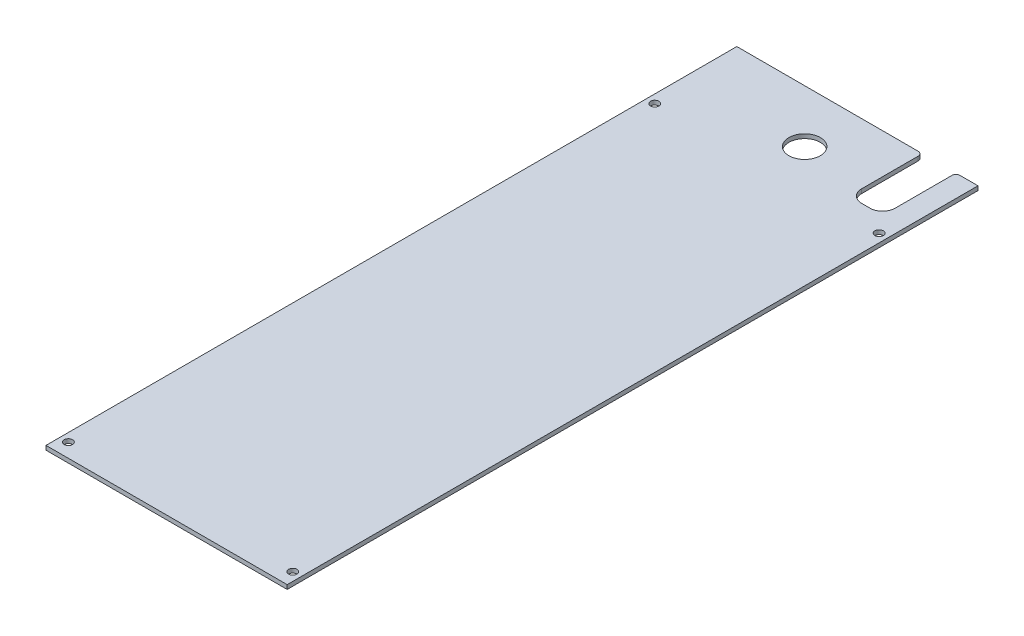
ISO-10303-21;
HEADER;
FILE_DESCRIPTION(('STEP AP214'),'2;1');
FILE_NAME('part.step','',(''),(''),'','','');
FILE_SCHEMA(('AUTOMOTIVE_DESIGN { 1 0 10303 214 1 1 1 1 }'));
ENDSEC;
DATA;
#1=APPLICATION_CONTEXT('core data for automotive mechanical design processes');
#2=APPLICATION_PROTOCOL_DEFINITION('international standard','automotive_design',2000,#1);
#3=PRODUCT_CONTEXT('',#1,'mechanical');
#4=PRODUCT('Part','Part','',(#3));
#5=PRODUCT_RELATED_PRODUCT_CATEGORY('part','',(#4));
#6=PRODUCT_DEFINITION_FORMATION('','',#4);
#7=PRODUCT_DEFINITION_CONTEXT('part definition',#1,'design');
#8=PRODUCT_DEFINITION('design','',#6,#7);
#9=PRODUCT_DEFINITION_SHAPE('','',#8);
#10=(LENGTH_UNIT() NAMED_UNIT(*) SI_UNIT(.MILLI.,.METRE.));
#11=(NAMED_UNIT(*) PLANE_ANGLE_UNIT() SI_UNIT($,.RADIAN.));
#12=(NAMED_UNIT(*) SI_UNIT($,.STERADIAN.) SOLID_ANGLE_UNIT());
#13=UNCERTAINTY_MEASURE_WITH_UNIT(LENGTH_MEASURE(1.E-05),#10,'distance_accuracy_value','');
#14=(GEOMETRIC_REPRESENTATION_CONTEXT(3) GLOBAL_UNCERTAINTY_ASSIGNED_CONTEXT((#13)) GLOBAL_UNIT_ASSIGNED_CONTEXT((#10,
#11,#12)) REPRESENTATION_CONTEXT('',''));
#15=CARTESIAN_POINT('',(0.,0.,0.));
#16=DIRECTION('',(0.,0.,1.));
#17=DIRECTION('',(1.,0.,0.));
#18=AXIS2_PLACEMENT_3D('',#15,#16,#17);
#19=CARTESIAN_POINT('',(-57.5,-2.,-121.41));
#20=DIRECTION('',(0.,0.,-1.));
#21=DIRECTION('',(-1.,0.,0.));
#22=AXIS2_PLACEMENT_3D('',#19,#20,#21);
#23=PLANE('',#22);
#24=DIRECTION('',(-1.,0.,0.));
#25=VECTOR('',#24,1.);
#26=CARTESIAN_POINT('',(-57.5,0.,-121.41));
#27=LINE('',#26,#25);
#28=CARTESIAN_POINT('',(29.,0.,-121.41));
#29=VERTEX_POINT('',#28);
#30=CARTESIAN_POINT('',(-57.5,0.,-121.41));
#31=VERTEX_POINT('',#30);
#32=EDGE_CURVE('E169',#29,#31,#27,.T.);
#33=ORIENTED_EDGE('',*,*,#32,.F.);
#34=DIRECTION('',(0.,1.,0.));
#35=VECTOR('',#34,1.);
#36=CARTESIAN_POINT('',(29.,-2.,-121.41));
#37=LINE('',#36,#35);
#38=CARTESIAN_POINT('',(29.,-2.,-121.41));
#39=VERTEX_POINT('',#38);
#40=EDGE_CURVE('E11',#29,#39,#37,.F.);
#41=ORIENTED_EDGE('',*,*,#40,.T.);
#42=DIRECTION('',(-1.,0.,0.));
#43=VECTOR('',#42,1.);
#44=CARTESIAN_POINT('',(-57.5,-2.,-121.41));
#45=LINE('',#44,#43);
#46=CARTESIAN_POINT('',(-57.5,-2.,-121.41));
#47=VERTEX_POINT('',#46);
#48=EDGE_CURVE('E151',#39,#47,#45,.T.);
#49=ORIENTED_EDGE('',*,*,#48,.T.);
#50=DIRECTION('',(0.,1.,0.));
#51=VECTOR('',#50,1.);
#52=CARTESIAN_POINT('',(-57.5,-2.,-121.41));
#53=LINE('',#52,#51);
#54=EDGE_CURVE('E138',#47,#31,#53,.T.);
#55=ORIENTED_EDGE('',*,*,#54,.T.);
#56=EDGE_LOOP('',(#33,#41,#49,#55));
#57=FACE_BOUND('',#56,.T.);
#58=ADVANCED_FACE('F38',(#57),#23,.T.);
#59=CARTESIAN_POINT('',(57.5,-2.,207.99));
#60=DIRECTION('',(1.,0.,0.));
#61=DIRECTION('',(0.,0.,-1.));
#62=AXIS2_PLACEMENT_3D('',#59,#60,#61);
#63=PLANE('',#62);
#64=DIRECTION('',(0.,0.,-1.));
#65=VECTOR('',#64,1.);
#66=CARTESIAN_POINT('',(57.5,0.,207.99));
#67=LINE('',#66,#65);
#68=CARTESIAN_POINT('',(57.5,0.,207.99));
#69=VERTEX_POINT('',#68);
#70=CARTESIAN_POINT('',(57.5,0.,-121.41));
#71=VERTEX_POINT('',#70);
#72=EDGE_CURVE('E167',#69,#71,#67,.T.);
#73=ORIENTED_EDGE('',*,*,#72,.F.);
#74=DIRECTION('',(0.,1.,0.));
#75=VECTOR('',#74,1.);
#76=CARTESIAN_POINT('',(57.5,-2.,207.99));
#77=LINE('',#76,#75);
#78=CARTESIAN_POINT('',(57.5,-2.,207.99));
#79=VERTEX_POINT('',#78);
#80=EDGE_CURVE('E154',#79,#69,#77,.T.);
#81=ORIENTED_EDGE('',*,*,#80,.F.);
#82=DIRECTION('',(0.,0.,-1.));
#83=VECTOR('',#82,1.);
#84=CARTESIAN_POINT('',(57.5,-2.,207.99));
#85=LINE('',#84,#83);
#86=CARTESIAN_POINT('',(57.5,-2.,-121.41));
#87=VERTEX_POINT('',#86);
#88=EDGE_CURVE('E146',#79,#87,#85,.T.);
#89=ORIENTED_EDGE('',*,*,#88,.T.);
#90=DIRECTION('',(0.,1.,0.));
#91=VECTOR('',#90,1.);
#92=CARTESIAN_POINT('',(57.5,-2.,-121.41));
#93=LINE('',#92,#91);
#94=EDGE_CURVE('E126',#87,#71,#93,.T.);
#95=ORIENTED_EDGE('',*,*,#94,.T.);
#96=EDGE_LOOP('',(#73,#81,#89,#95));
#97=FACE_BOUND('',#96,.T.);
#98=ADVANCED_FACE('F153',(#97),#63,.T.);
#99=CARTESIAN_POINT('',(-57.5,-2.,207.99));
#100=DIRECTION('',(0.,0.,1.));
#101=DIRECTION('',(1.,0.,0.));
#102=AXIS2_PLACEMENT_3D('',#99,#100,#101);
#103=PLANE('',#102);
#104=DIRECTION('',(1.,0.,0.));
#105=VECTOR('',#104,1.);
#106=CARTESIAN_POINT('',(-57.5,0.,207.99));
#107=LINE('',#106,#105);
#108=CARTESIAN_POINT('',(-57.5,0.,207.99));
#109=VERTEX_POINT('',#108);
#110=EDGE_CURVE('E155',#109,#69,#107,.T.);
#111=ORIENTED_EDGE('',*,*,#110,.F.);
#112=DIRECTION('',(0.,1.,0.));
#113=VECTOR('',#112,1.);
#114=CARTESIAN_POINT('',(-57.5,-2.,207.99));
#115=LINE('',#114,#113);
#116=CARTESIAN_POINT('',(-57.5,-2.,207.99));
#117=VERTEX_POINT('',#116);
#118=EDGE_CURVE('E176',#117,#109,#115,.T.);
#119=ORIENTED_EDGE('',*,*,#118,.F.);
#120=DIRECTION('',(1.,0.,0.));
#121=VECTOR('',#120,1.);
#122=CARTESIAN_POINT('',(-57.5,-2.,207.99));
#123=LINE('',#122,#121);
#124=EDGE_CURVE('E139',#117,#79,#123,.T.);
#125=ORIENTED_EDGE('',*,*,#124,.T.);
#126=ORIENTED_EDGE('',*,*,#80,.T.);
#127=EDGE_LOOP('',(#111,#119,#125,#126));
#128=FACE_BOUND('',#127,.T.);
#129=ADVANCED_FACE('F280',(#128),#103,.T.);
#130=CARTESIAN_POINT('',(-57.5,-2.,207.99));
#131=DIRECTION('',(-1.,0.,0.));
#132=DIRECTION('',(0.,0.,1.));
#133=AXIS2_PLACEMENT_3D('',#130,#131,#132);
#134=PLANE('',#133);
#135=DIRECTION('',(0.,0.,1.));
#136=VECTOR('',#135,1.);
#137=CARTESIAN_POINT('',(-57.5,0.,207.99));
#138=LINE('',#137,#136);
#139=EDGE_CURVE('E158',#31,#109,#138,.T.);
#140=ORIENTED_EDGE('',*,*,#139,.F.);
#141=ORIENTED_EDGE('',*,*,#54,.F.);
#142=DIRECTION('',(0.,0.,1.));
#143=VECTOR('',#142,1.);
#144=CARTESIAN_POINT('',(-57.5,-2.,207.99));
#145=LINE('',#144,#143);
#146=EDGE_CURVE('E150',#47,#117,#145,.T.);
#147=ORIENTED_EDGE('',*,*,#146,.T.);
#148=ORIENTED_EDGE('',*,*,#118,.T.);
#149=EDGE_LOOP('',(#140,#141,#147,#148));
#150=FACE_BOUND('',#149,.T.);
#151=ADVANCED_FACE('F284',(#150),#134,.T.);
#152=CARTESIAN_POINT('',(49.,-2.,-121.41));
#153=VERTEX_POINT('',#152);
#154=EDGE_CURVE('E130',#87,#153,#45,.T.);
#155=ORIENTED_EDGE('',*,*,#154,.T.);
#156=DIRECTION('',(0.,1.,0.));
#157=VECTOR('',#156,1.);
#158=CARTESIAN_POINT('',(49.,0.,-121.41));
#159=LINE('',#158,#157);
#160=CARTESIAN_POINT('',(49.,0.,-121.41));
#161=VERTEX_POINT('',#160);
#162=EDGE_CURVE('E199',#153,#161,#159,.T.);
#163=ORIENTED_EDGE('',*,*,#162,.T.);
#164=EDGE_CURVE('E133',#71,#161,#27,.T.);
#165=ORIENTED_EDGE('',*,*,#164,.F.);
#166=ORIENTED_EDGE('',*,*,#94,.F.);
#167=EDGE_LOOP('',(#155,#163,#165,#166));
#168=FACE_BOUND('',#167,.T.);
#169=ADVANCED_FACE('F128',(#168),#23,.T.);
#170=CARTESIAN_POINT('',(0.,-2.,0.));
#171=DIRECTION('',(0.,-1.,0.));
#172=DIRECTION('',(0.,0.,-1.));
#173=AXIS2_PLACEMENT_3D('',#170,#171,#172);
#174=PLANE('',#173);
#175=DIRECTION('',(0.,0.,-1.));
#176=VECTOR('',#175,1.);
#177=CARTESIAN_POINT('',(47.,-2.,-121.41));
#178=LINE('',#177,#176);
#179=CARTESIAN_POINT('',(47.,-2.,-92.41));
#180=VERTEX_POINT('',#179);
#181=CARTESIAN_POINT('',(47.,-2.,-119.41));
#182=VERTEX_POINT('',#181);
#183=EDGE_CURVE('E226',#180,#182,#178,.T.);
#184=ORIENTED_EDGE('',*,*,#183,.T.);
#185=CARTESIAN_POINT('',(49.,-2.,-119.41));
#186=DIRECTION('',(0.,-1.,0.));
#187=DIRECTION('',(0.,0.,-1.));
#188=AXIS2_PLACEMENT_3D('',#185,#186,#187);
#189=CIRCLE('',#188,2.);
#190=EDGE_CURVE('E149',#182,#153,#189,.T.);
#191=ORIENTED_EDGE('',*,*,#190,.T.);
#192=ORIENTED_EDGE('',*,*,#154,.F.);
#193=ORIENTED_EDGE('',*,*,#88,.F.);
#194=ORIENTED_EDGE('',*,*,#124,.F.);
#195=ORIENTED_EDGE('',*,*,#146,.F.);
#196=ORIENTED_EDGE('',*,*,#48,.F.);
#197=CARTESIAN_POINT('',(29.,-2.,-119.41));
#198=DIRECTION('',(0.,-1.,0.));
#199=DIRECTION('',(0.,0.,-1.));
#200=AXIS2_PLACEMENT_3D('',#197,#198,#199);
#201=CIRCLE('',#200,2.);
#202=CARTESIAN_POINT('',(31.,-2.,-119.41));
#203=VERTEX_POINT('',#202);
#204=EDGE_CURVE('E58',#39,#203,#201,.T.);
#205=ORIENTED_EDGE('',*,*,#204,.T.);
#206=DIRECTION('',(0.,0.,1.));
#207=VECTOR('',#206,1.);
#208=CARTESIAN_POINT('',(31.,-2.,-121.41));
#209=LINE('',#208,#207);
#210=CARTESIAN_POINT('',(31.,-2.,-92.41));
#211=VERTEX_POINT('',#210);
#212=EDGE_CURVE('E214',#203,#211,#209,.T.);
#213=ORIENTED_EDGE('',*,*,#212,.T.);
#214=CARTESIAN_POINT('',(37.,-2.,-92.41));
#215=DIRECTION('',(0.,-1.,0.));
#216=DIRECTION('',(0.,0.,-1.));
#217=AXIS2_PLACEMENT_3D('',#214,#215,#216);
#218=CIRCLE('',#217,6.);
#219=CARTESIAN_POINT('',(37.,-2.,-86.41));
#220=VERTEX_POINT('',#219);
#221=EDGE_CURVE('E197',#211,#220,#218,.F.);
#222=ORIENTED_EDGE('',*,*,#221,.T.);
#223=DIRECTION('',(1.,0.,0.));
#224=VECTOR('',#223,1.);
#225=CARTESIAN_POINT('',(31.,-2.,-86.41));
#226=LINE('',#225,#224);
#227=CARTESIAN_POINT('',(41.,-2.,-86.41));
#228=VERTEX_POINT('',#227);
#229=EDGE_CURVE('E329',#220,#228,#226,.T.);
#230=ORIENTED_EDGE('',*,*,#229,.T.);
#231=CARTESIAN_POINT('',(41.,-2.,-92.41));
#232=DIRECTION('',(0.,-1.,0.));
#233=DIRECTION('',(0.,0.,-1.));
#234=AXIS2_PLACEMENT_3D('',#231,#232,#233);
#235=CIRCLE('',#234,6.);
#236=EDGE_CURVE('E192',#228,#180,#235,.F.);
#237=ORIENTED_EDGE('',*,*,#236,.T.);
#238=EDGE_LOOP('',(#184,#191,#192,#193,#194,#195,#196,#205,#213,#222,#230,#237));
#239=FACE_BOUND('',#238,.T.);
#240=CARTESIAN_POINT('',(0.,-2.,-96.25));
#241=DIRECTION('',(0.,-1.,0.));
#242=DIRECTION('',(0.,0.,-1.));
#243=AXIS2_PLACEMENT_3D('',#240,#241,#242);
#244=CIRCLE('',#243,7.5);
#245=CARTESIAN_POINT('',(0.,-2.,-103.75));
#246=VERTEX_POINT('',#245);
#247=EDGE_CURVE('E235',#246,#246,#244,.F.);
#248=ORIENTED_EDGE('',*,*,#247,.T.);
#249=EDGE_LOOP('',(#248));
#250=FACE_BOUND('',#249,.T.);
#251=CARTESIAN_POINT('',(53.5000000000001,-2.,201.3));
#252=DIRECTION('',(0.,-1.,0.));
#253=DIRECTION('',(0.,0.,-1.));
#254=AXIS2_PLACEMENT_3D('',#251,#252,#253);
#255=CIRCLE('',#254,2.);
#256=CARTESIAN_POINT('',(53.5000000000001,-2.,199.3));
#257=VERTEX_POINT('',#256);
#258=EDGE_CURVE('E234',#257,#257,#255,.F.);
#259=ORIENTED_EDGE('',*,*,#258,.T.);
#260=EDGE_LOOP('',(#259));
#261=FACE_BOUND('',#260,.T.);
#262=CARTESIAN_POINT('',(53.5,-2.,-78.2599999999999));
#263=DIRECTION('',(0.,-1.,0.));
#264=DIRECTION('',(0.,0.,-1.));
#265=AXIS2_PLACEMENT_3D('',#262,#263,#264);
#266=CIRCLE('',#265,2.);
#267=CARTESIAN_POINT('',(53.5,-2.,-80.26));
#268=VERTEX_POINT('',#267);
#269=EDGE_CURVE('E241',#268,#268,#266,.F.);
#270=ORIENTED_EDGE('',*,*,#269,.T.);
#271=EDGE_LOOP('',(#270));
#272=FACE_BOUND('',#271,.T.);
#273=CARTESIAN_POINT('',(-53.5,-2.,-78.2599999999999));
#274=DIRECTION('',(0.,-1.,0.));
#275=DIRECTION('',(0.,0.,-1.));
#276=AXIS2_PLACEMENT_3D('',#273,#274,#275);
#277=CIRCLE('',#276,2.);
#278=CARTESIAN_POINT('',(-53.5,-2.,-80.2599999999999));
#279=VERTEX_POINT('',#278);
#280=EDGE_CURVE('E247',#279,#279,#277,.F.);
#281=ORIENTED_EDGE('',*,*,#280,.T.);
#282=EDGE_LOOP('',(#281));
#283=FACE_BOUND('',#282,.T.);
#284=CARTESIAN_POINT('',(-53.5,-2.,201.3));
#285=DIRECTION('',(0.,-1.,0.));
#286=DIRECTION('',(0.,0.,-1.));
#287=AXIS2_PLACEMENT_3D('',#284,#285,#286);
#288=CIRCLE('',#287,2.);
#289=CARTESIAN_POINT('',(-53.5,-2.,199.3));
#290=VERTEX_POINT('',#289);
#291=EDGE_CURVE('E161',#290,#290,#288,.F.);
#292=ORIENTED_EDGE('',*,*,#291,.T.);
#293=EDGE_LOOP('',(#292));
#294=FACE_BOUND('',#293,.T.);
#295=ADVANCED_FACE('F143',(#239,#250,#261,#272,#283,#294),#174,.T.);
#296=CARTESIAN_POINT('',(0.,0.,0.));
#297=DIRECTION('',(0.,-1.,0.));
#298=DIRECTION('',(0.,0.,-1.));
#299=AXIS2_PLACEMENT_3D('',#296,#297,#298);
#300=PLANE('',#299);
#301=CARTESIAN_POINT('',(0.,0.,-96.25));
#302=DIRECTION('',(0.,1.,0.));
#303=DIRECTION('',(0.,0.,1.));
#304=AXIS2_PLACEMENT_3D('',#301,#302,#303);
#305=CIRCLE('',#304,7.5);
#306=CARTESIAN_POINT('',(0.,0.,-88.75));
#307=VERTEX_POINT('',#306);
#308=EDGE_CURVE('E231',#307,#307,#305,.T.);
#309=ORIENTED_EDGE('',*,*,#308,.F.);
#310=EDGE_LOOP('',(#309));
#311=FACE_BOUND('',#310,.T.);
#312=CARTESIAN_POINT('',(53.5000000000001,0.,201.3));
#313=DIRECTION('',(0.,1.,0.));
#314=DIRECTION('',(0.,0.,-1.));
#315=AXIS2_PLACEMENT_3D('',#312,#313,#314);
#316=CIRCLE('',#315,2.);
#317=CARTESIAN_POINT('',(53.5000000000001,0.,199.3));
#318=VERTEX_POINT('',#317);
#319=EDGE_CURVE('E238',#318,#318,#316,.T.);
#320=ORIENTED_EDGE('',*,*,#319,.F.);
#321=EDGE_LOOP('',(#320));
#322=FACE_BOUND('',#321,.T.);
#323=CARTESIAN_POINT('',(53.5,0.,-78.2599999999999));
#324=DIRECTION('',(0.,1.,0.));
#325=DIRECTION('',(0.,0.,-1.));
#326=AXIS2_PLACEMENT_3D('',#323,#324,#325);
#327=CIRCLE('',#326,2.);
#328=CARTESIAN_POINT('',(53.5,0.,-80.26));
#329=VERTEX_POINT('',#328);
#330=EDGE_CURVE('E244',#329,#329,#327,.T.);
#331=ORIENTED_EDGE('',*,*,#330,.F.);
#332=EDGE_LOOP('',(#331));
#333=FACE_BOUND('',#332,.T.);
#334=CARTESIAN_POINT('',(-53.5,0.,-78.2599999999999));
#335=DIRECTION('',(0.,1.,0.));
#336=DIRECTION('',(0.,0.,1.));
#337=AXIS2_PLACEMENT_3D('',#334,#335,#336);
#338=CIRCLE('',#337,2.);
#339=CARTESIAN_POINT('',(-53.5,0.,-76.2599999999999));
#340=VERTEX_POINT('',#339);
#341=EDGE_CURVE('E250',#340,#340,#338,.T.);
#342=ORIENTED_EDGE('',*,*,#341,.F.);
#343=EDGE_LOOP('',(#342));
#344=FACE_BOUND('',#343,.T.);
#345=CARTESIAN_POINT('',(-53.5,0.,201.3));
#346=DIRECTION('',(0.,1.,0.));
#347=DIRECTION('',(0.,0.,1.));
#348=AXIS2_PLACEMENT_3D('',#345,#346,#347);
#349=CIRCLE('',#348,2.);
#350=CARTESIAN_POINT('',(-53.5,0.,203.3));
#351=VERTEX_POINT('',#350);
#352=EDGE_CURVE('E170',#351,#351,#349,.T.);
#353=ORIENTED_EDGE('',*,*,#352,.F.);
#354=EDGE_LOOP('',(#353));
#355=FACE_BOUND('',#354,.T.);
#356=ORIENTED_EDGE('',*,*,#164,.T.);
#357=CARTESIAN_POINT('',(49.,0.,-119.41));
#358=DIRECTION('',(0.,-1.,0.));
#359=DIRECTION('',(0.,0.,-1.));
#360=AXIS2_PLACEMENT_3D('',#357,#358,#359);
#361=CIRCLE('',#360,2.);
#362=CARTESIAN_POINT('',(47.,0.,-119.41));
#363=VERTEX_POINT('',#362);
#364=EDGE_CURVE('E203',#161,#363,#361,.F.);
#365=ORIENTED_EDGE('',*,*,#364,.T.);
#366=DIRECTION('',(0.,0.,-1.));
#367=VECTOR('',#366,1.);
#368=CARTESIAN_POINT('',(47.,0.,-121.41));
#369=LINE('',#368,#367);
#370=CARTESIAN_POINT('',(47.,0.,-92.41));
#371=VERTEX_POINT('',#370);
#372=EDGE_CURVE('E223',#371,#363,#369,.T.);
#373=ORIENTED_EDGE('',*,*,#372,.F.);
#374=CARTESIAN_POINT('',(41.,0.,-92.41));
#375=DIRECTION('',(0.,-1.,0.));
#376=DIRECTION('',(0.,0.,-1.));
#377=AXIS2_PLACEMENT_3D('',#374,#375,#376);
#378=CIRCLE('',#377,6.);
#379=CARTESIAN_POINT('',(41.,0.,-86.41));
#380=VERTEX_POINT('',#379);
#381=EDGE_CURVE('E190',#371,#380,#378,.T.);
#382=ORIENTED_EDGE('',*,*,#381,.T.);
#383=DIRECTION('',(1.,0.,0.));
#384=VECTOR('',#383,1.);
#385=CARTESIAN_POINT('',(31.,0.,-86.41));
#386=LINE('',#385,#384);
#387=CARTESIAN_POINT('',(37.,0.,-86.41));
#388=VERTEX_POINT('',#387);
#389=EDGE_CURVE('E220',#388,#380,#386,.T.);
#390=ORIENTED_EDGE('',*,*,#389,.F.);
#391=CARTESIAN_POINT('',(37.,0.,-92.41));
#392=DIRECTION('',(0.,-1.,0.));
#393=DIRECTION('',(0.,0.,-1.));
#394=AXIS2_PLACEMENT_3D('',#391,#392,#393);
#395=CIRCLE('',#394,6.);
#396=CARTESIAN_POINT('',(31.,0.,-92.41));
#397=VERTEX_POINT('',#396);
#398=EDGE_CURVE('E194',#388,#397,#395,.T.);
#399=ORIENTED_EDGE('',*,*,#398,.T.);
#400=DIRECTION('',(0.,0.,1.));
#401=VECTOR('',#400,1.);
#402=CARTESIAN_POINT('',(31.,0.,-121.41));
#403=LINE('',#402,#401);
#404=CARTESIAN_POINT('',(31.,0.,-119.41));
#405=VERTEX_POINT('',#404);
#406=EDGE_CURVE('E213',#405,#397,#403,.T.);
#407=ORIENTED_EDGE('',*,*,#406,.F.);
#408=CARTESIAN_POINT('',(29.,0.,-119.41));
#409=DIRECTION('',(0.,-1.,0.));
#410=DIRECTION('',(0.,0.,-1.));
#411=AXIS2_PLACEMENT_3D('',#408,#409,#410);
#412=CIRCLE('',#411,2.);
#413=EDGE_CURVE('E201',#405,#29,#412,.F.);
#414=ORIENTED_EDGE('',*,*,#413,.T.);
#415=ORIENTED_EDGE('',*,*,#32,.T.);
#416=ORIENTED_EDGE('',*,*,#139,.T.);
#417=ORIENTED_EDGE('',*,*,#110,.T.);
#418=ORIENTED_EDGE('',*,*,#72,.T.);
#419=EDGE_LOOP('',(#356,#365,#373,#382,#390,#399,#407,#414,#415,#416,#417,#418));
#420=FACE_BOUND('',#419,.T.);
#421=ADVANCED_FACE('F217',(#311,#322,#333,#344,#355,#420),#300,.F.);
#422=CARTESIAN_POINT('',(-53.5,-2.001,201.3));
#423=DIRECTION('',(0.,1.,0.));
#424=DIRECTION('',(0.,0.,1.));
#425=AXIS2_PLACEMENT_3D('',#422,#423,#424);
#426=CYLINDRICAL_SURFACE('',#425,2.);
#427=ORIENTED_EDGE('',*,*,#291,.F.);
#428=EDGE_LOOP('',(#427));
#429=FACE_BOUND('',#428,.T.);
#430=ORIENTED_EDGE('',*,*,#352,.T.);
#431=EDGE_LOOP('',(#430));
#432=FACE_BOUND('',#431,.T.);
#433=ADVANCED_FACE('F261',(#429,#432),#426,.F.);
#434=CARTESIAN_POINT('',(-53.5,-2.001,-78.2599999999999));
#435=DIRECTION('',(0.,1.,0.));
#436=DIRECTION('',(0.,0.,1.));
#437=AXIS2_PLACEMENT_3D('',#434,#435,#436);
#438=CYLINDRICAL_SURFACE('',#437,2.);
#439=ORIENTED_EDGE('',*,*,#280,.F.);
#440=EDGE_LOOP('',(#439));
#441=FACE_BOUND('',#440,.T.);
#442=ORIENTED_EDGE('',*,*,#341,.T.);
#443=EDGE_LOOP('',(#442));
#444=FACE_BOUND('',#443,.T.);
#445=ADVANCED_FACE('F263',(#441,#444),#438,.F.);
#446=CARTESIAN_POINT('',(53.5,-2.001,-78.2599999999999));
#447=DIRECTION('',(0.,1.,0.));
#448=DIRECTION('',(0.,0.,1.));
#449=AXIS2_PLACEMENT_3D('',#446,#447,#448);
#450=CYLINDRICAL_SURFACE('',#449,2.);
#451=ORIENTED_EDGE('',*,*,#269,.F.);
#452=EDGE_LOOP('',(#451));
#453=FACE_BOUND('',#452,.T.);
#454=ORIENTED_EDGE('',*,*,#330,.T.);
#455=EDGE_LOOP('',(#454));
#456=FACE_BOUND('',#455,.T.);
#457=ADVANCED_FACE('F269',(#453,#456),#450,.F.);
#458=CARTESIAN_POINT('',(53.5000000000001,-2.001,201.3));
#459=DIRECTION('',(0.,1.,0.));
#460=DIRECTION('',(0.,0.,1.));
#461=AXIS2_PLACEMENT_3D('',#458,#459,#460);
#462=CYLINDRICAL_SURFACE('',#461,2.);
#463=ORIENTED_EDGE('',*,*,#258,.F.);
#464=EDGE_LOOP('',(#463));
#465=FACE_BOUND('',#464,.T.);
#466=ORIENTED_EDGE('',*,*,#319,.T.);
#467=EDGE_LOOP('',(#466));
#468=FACE_BOUND('',#467,.T.);
#469=ADVANCED_FACE('F343',(#465,#468),#462,.F.);
#470=CARTESIAN_POINT('',(0.,-2.001,-96.25));
#471=DIRECTION('',(0.,1.,0.));
#472=DIRECTION('',(0.,0.,1.));
#473=AXIS2_PLACEMENT_3D('',#470,#471,#472);
#474=CYLINDRICAL_SURFACE('',#473,7.5);
#475=ORIENTED_EDGE('',*,*,#247,.F.);
#476=EDGE_LOOP('',(#475));
#477=FACE_BOUND('',#476,.T.);
#478=ORIENTED_EDGE('',*,*,#308,.T.);
#479=EDGE_LOOP('',(#478));
#480=FACE_BOUND('',#479,.T.);
#481=ADVANCED_FACE('F340',(#477,#480),#474,.F.);
#482=CARTESIAN_POINT('',(31.,-2.,-121.41));
#483=DIRECTION('',(-1.,0.,0.));
#484=DIRECTION('',(0.,0.,1.));
#485=AXIS2_PLACEMENT_3D('',#482,#483,#484);
#486=PLANE('',#485);
#487=ORIENTED_EDGE('',*,*,#212,.F.);
#488=DIRECTION('',(0.,1.,0.));
#489=VECTOR('',#488,1.);
#490=CARTESIAN_POINT('',(31.,0.,-119.41));
#491=LINE('',#490,#489);
#492=EDGE_CURVE('E46',#203,#405,#491,.T.);
#493=ORIENTED_EDGE('',*,*,#492,.T.);
#494=ORIENTED_EDGE('',*,*,#406,.T.);
#495=DIRECTION('',(0.,1.,0.));
#496=VECTOR('',#495,1.);
#497=CARTESIAN_POINT('',(31.,-2.,-92.41));
#498=LINE('',#497,#496);
#499=EDGE_CURVE('E187',#397,#211,#498,.F.);
#500=ORIENTED_EDGE('',*,*,#499,.T.);
#501=EDGE_LOOP('',(#487,#493,#494,#500));
#502=FACE_BOUND('',#501,.T.);
#503=ADVANCED_FACE('F212',(#502),#486,.F.);
#504=CARTESIAN_POINT('',(47.,-2.,-121.41));
#505=DIRECTION('',(1.,0.,0.));
#506=DIRECTION('',(0.,0.,-1.));
#507=AXIS2_PLACEMENT_3D('',#504,#505,#506);
#508=PLANE('',#507);
#509=ORIENTED_EDGE('',*,*,#372,.T.);
#510=DIRECTION('',(0.,1.,0.));
#511=VECTOR('',#510,1.);
#512=CARTESIAN_POINT('',(47.,-2.,-119.41));
#513=LINE('',#512,#511);
#514=EDGE_CURVE('E205',#363,#182,#513,.F.);
#515=ORIENTED_EDGE('',*,*,#514,.T.);
#516=ORIENTED_EDGE('',*,*,#183,.F.);
#517=DIRECTION('',(0.,1.,0.));
#518=VECTOR('',#517,1.);
#519=CARTESIAN_POINT('',(47.,0.,-92.41));
#520=LINE('',#519,#518);
#521=EDGE_CURVE('E175',#180,#371,#520,.T.);
#522=ORIENTED_EDGE('',*,*,#521,.T.);
#523=EDGE_LOOP('',(#509,#515,#516,#522));
#524=FACE_BOUND('',#523,.T.);
#525=ADVANCED_FACE('F303',(#524),#508,.F.);
#526=CARTESIAN_POINT('',(31.,-2.,-86.41));
#527=DIRECTION('',(0.,0.,1.));
#528=DIRECTION('',(1.,0.,0.));
#529=AXIS2_PLACEMENT_3D('',#526,#527,#528);
#530=PLANE('',#529);
#531=ORIENTED_EDGE('',*,*,#389,.T.);
#532=DIRECTION('',(0.,1.,0.));
#533=VECTOR('',#532,1.);
#534=CARTESIAN_POINT('',(41.,-2.,-86.41));
#535=LINE('',#534,#533);
#536=EDGE_CURVE('E185',#380,#228,#535,.F.);
#537=ORIENTED_EDGE('',*,*,#536,.T.);
#538=ORIENTED_EDGE('',*,*,#229,.F.);
#539=DIRECTION('',(0.,1.,0.));
#540=VECTOR('',#539,1.);
#541=CARTESIAN_POINT('',(37.,0.,-86.41));
#542=LINE('',#541,#540);
#543=EDGE_CURVE('E182',#220,#388,#542,.T.);
#544=ORIENTED_EDGE('',*,*,#543,.T.);
#545=EDGE_LOOP('',(#531,#537,#538,#544));
#546=FACE_BOUND('',#545,.T.);
#547=ADVANCED_FACE('F318',(#546),#530,.F.);
#548=CARTESIAN_POINT('',(41.,-2.,-92.41));
#549=DIRECTION('',(0.,-1.,0.));
#550=DIRECTION('',(0.,0.,-1.));
#551=AXIS2_PLACEMENT_3D('',#548,#549,#550);
#552=CYLINDRICAL_SURFACE('',#551,6.);
#553=ORIENTED_EDGE('',*,*,#236,.F.);
#554=ORIENTED_EDGE('',*,*,#536,.F.);
#555=ORIENTED_EDGE('',*,*,#381,.F.);
#556=ORIENTED_EDGE('',*,*,#521,.F.);
#557=EDGE_LOOP('',(#553,#554,#555,#556));
#558=FACE_BOUND('',#557,.T.);
#559=ADVANCED_FACE('F313',(#558),#552,.F.);
#560=CARTESIAN_POINT('',(37.,-2.,-92.41));
#561=DIRECTION('',(0.,-1.,0.));
#562=DIRECTION('',(0.,0.,-1.));
#563=AXIS2_PLACEMENT_3D('',#560,#561,#562);
#564=CYLINDRICAL_SURFACE('',#563,6.);
#565=ORIENTED_EDGE('',*,*,#221,.F.);
#566=ORIENTED_EDGE('',*,*,#499,.F.);
#567=ORIENTED_EDGE('',*,*,#398,.F.);
#568=ORIENTED_EDGE('',*,*,#543,.F.);
#569=EDGE_LOOP('',(#565,#566,#567,#568));
#570=FACE_BOUND('',#569,.T.);
#571=ADVANCED_FACE('F308',(#570),#564,.F.);
#572=CARTESIAN_POINT('',(49.,-2.,-119.41));
#573=DIRECTION('',(0.,-1.,0.));
#574=DIRECTION('',(0.,0.,-1.));
#575=AXIS2_PLACEMENT_3D('',#572,#573,#574);
#576=CYLINDRICAL_SURFACE('',#575,2.);
#577=ORIENTED_EDGE('',*,*,#190,.F.);
#578=ORIENTED_EDGE('',*,*,#514,.F.);
#579=ORIENTED_EDGE('',*,*,#364,.F.);
#580=ORIENTED_EDGE('',*,*,#162,.F.);
#581=EDGE_LOOP('',(#577,#578,#579,#580));
#582=FACE_BOUND('',#581,.T.);
#583=ADVANCED_FACE('F306',(#582),#576,.T.);
#584=CARTESIAN_POINT('',(29.,-2.,-119.41));
#585=DIRECTION('',(0.,-1.,0.));
#586=DIRECTION('',(0.,0.,-1.));
#587=AXIS2_PLACEMENT_3D('',#584,#585,#586);
#588=CYLINDRICAL_SURFACE('',#587,2.);
#589=ORIENTED_EDGE('',*,*,#204,.F.);
#590=ORIENTED_EDGE('',*,*,#40,.F.);
#591=ORIENTED_EDGE('',*,*,#413,.F.);
#592=ORIENTED_EDGE('',*,*,#492,.F.);
#593=EDGE_LOOP('',(#589,#590,#591,#592));
#594=FACE_BOUND('',#593,.T.);
#595=ADVANCED_FACE('F40',(#594),#588,.T.);
#596=CLOSED_SHELL('',(#58,#98,#129,#151,#169,#295,#421,#433,#445,#457,#469,#481,#503,#525,#547,
#559,#571,#583,#595));
#597=MANIFOLD_SOLID_BREP('B2',#596);
#598=ADVANCED_BREP_SHAPE_REPRESENTATION('',(#18,#597),#14);
#599=SHAPE_DEFINITION_REPRESENTATION(#9,#598);
ENDSEC;
END-ISO-10303-21;
